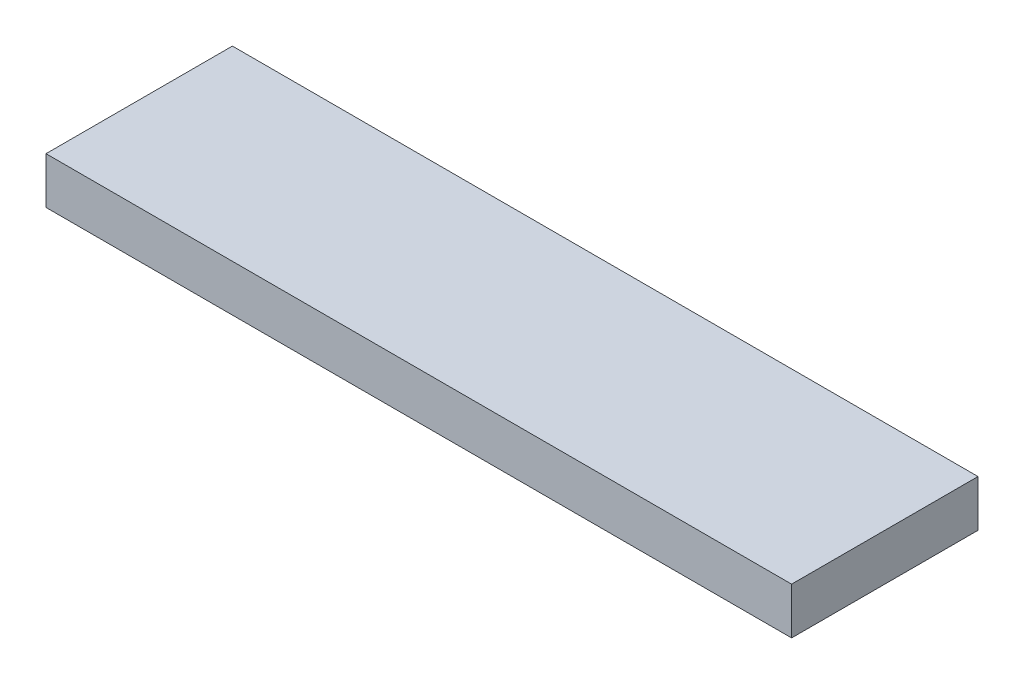
ISO-10303-21;
HEADER;
FILE_DESCRIPTION(('STEP AP214'),'2;1');
FILE_NAME('part.step','',(''),(''),'','','');
FILE_SCHEMA(('AUTOMOTIVE_DESIGN { 1 0 10303 214 1 1 1 1 }'));
ENDSEC;
DATA;
#1=APPLICATION_CONTEXT('core data for automotive mechanical design processes');
#2=APPLICATION_PROTOCOL_DEFINITION('international standard','automotive_design',2000,#1);
#3=PRODUCT_CONTEXT('',#1,'mechanical');
#4=PRODUCT('Part','Part','',(#3));
#5=PRODUCT_RELATED_PRODUCT_CATEGORY('part','',(#4));
#6=PRODUCT_DEFINITION_FORMATION('','',#4);
#7=PRODUCT_DEFINITION_CONTEXT('part definition',#1,'design');
#8=PRODUCT_DEFINITION('design','',#6,#7);
#9=PRODUCT_DEFINITION_SHAPE('','',#8);
#10=(LENGTH_UNIT() NAMED_UNIT(*) SI_UNIT(.MILLI.,.METRE.));
#11=(NAMED_UNIT(*) PLANE_ANGLE_UNIT() SI_UNIT($,.RADIAN.));
#12=(NAMED_UNIT(*) SI_UNIT($,.STERADIAN.) SOLID_ANGLE_UNIT());
#13=UNCERTAINTY_MEASURE_WITH_UNIT(LENGTH_MEASURE(1.E-05),#10,'distance_accuracy_value','');
#14=(GEOMETRIC_REPRESENTATION_CONTEXT(3) GLOBAL_UNCERTAINTY_ASSIGNED_CONTEXT((#13)) GLOBAL_UNIT_ASSIGNED_CONTEXT((#10,
#11,#12)) REPRESENTATION_CONTEXT('',''));
#15=CARTESIAN_POINT('',(0.,0.,0.));
#16=DIRECTION('',(0.,0.,1.));
#17=DIRECTION('',(1.,0.,0.));
#18=AXIS2_PLACEMENT_3D('',#15,#16,#17);
#19=CARTESIAN_POINT('',(0.,0.5,0.));
#20=DIRECTION('',(1.,0.,0.));
#21=DIRECTION('',(0.,0.,-1.));
#22=AXIS2_PLACEMENT_3D('',#19,#20,#21);
#23=PLANE('',#22);
#24=DIRECTION('',(0.,0.,1.));
#25=VECTOR('',#24,1.);
#26=CARTESIAN_POINT('',(0.,0.,0.));
#27=LINE('',#26,#25);
#28=CARTESIAN_POINT('',(0.,0.,-2.));
#29=VERTEX_POINT('',#28);
#30=CARTESIAN_POINT('',(0.,0.,0.));
#31=VERTEX_POINT('',#30);
#32=EDGE_CURVE('E113',#29,#31,#27,.T.);
#33=ORIENTED_EDGE('',*,*,#32,.T.);
#34=DIRECTION('',(0.,-1.,0.));
#35=VECTOR('',#34,1.);
#36=CARTESIAN_POINT('',(0.,0.5,0.));
#37=LINE('',#36,#35);
#38=CARTESIAN_POINT('',(0.,0.5,0.));
#39=VERTEX_POINT('',#38);
#40=EDGE_CURVE('E11',#39,#31,#37,.T.);
#41=ORIENTED_EDGE('',*,*,#40,.F.);
#42=DIRECTION('',(0.,0.,1.));
#43=VECTOR('',#42,1.);
#44=CARTESIAN_POINT('',(0.,0.5,0.));
#45=LINE('',#44,#43);
#46=CARTESIAN_POINT('',(0.,0.5,-2.));
#47=VERTEX_POINT('',#46);
#48=EDGE_CURVE('E97',#47,#39,#45,.T.);
#49=ORIENTED_EDGE('',*,*,#48,.F.);
#50=DIRECTION('',(0.,-1.,0.));
#51=VECTOR('',#50,1.);
#52=CARTESIAN_POINT('',(0.,0.5,-2.));
#53=LINE('',#52,#51);
#54=EDGE_CURVE('E109',#47,#29,#53,.T.);
#55=ORIENTED_EDGE('',*,*,#54,.T.);
#56=EDGE_LOOP('',(#33,#41,#49,#55));
#57=FACE_BOUND('',#56,.T.);
#58=ADVANCED_FACE('F45',(#57),#23,.F.);
#59=CARTESIAN_POINT('',(0.,0.5,0.));
#60=DIRECTION('',(0.,0.,-1.));
#61=DIRECTION('',(-1.,0.,0.));
#62=AXIS2_PLACEMENT_3D('',#59,#60,#61);
#63=PLANE('',#62);
#64=DIRECTION('',(1.,0.,0.));
#65=VECTOR('',#64,1.);
#66=CARTESIAN_POINT('',(0.,0.,0.));
#67=LINE('',#66,#65);
#68=CARTESIAN_POINT('',(8.,0.,0.));
#69=VERTEX_POINT('',#68);
#70=EDGE_CURVE('E102',#31,#69,#67,.T.);
#71=ORIENTED_EDGE('',*,*,#70,.T.);
#72=DIRECTION('',(0.,-1.,0.));
#73=VECTOR('',#72,1.);
#74=CARTESIAN_POINT('',(8.,0.5,0.));
#75=LINE('',#74,#73);
#76=CARTESIAN_POINT('',(8.,0.5,0.));
#77=VERTEX_POINT('',#76);
#78=EDGE_CURVE('E54',#77,#69,#75,.T.);
#79=ORIENTED_EDGE('',*,*,#78,.F.);
#80=DIRECTION('',(1.,0.,0.));
#81=VECTOR('',#80,1.);
#82=CARTESIAN_POINT('',(0.,0.5,0.));
#83=LINE('',#82,#81);
#84=EDGE_CURVE('E92',#39,#77,#83,.T.);
#85=ORIENTED_EDGE('',*,*,#84,.F.);
#86=ORIENTED_EDGE('',*,*,#40,.T.);
#87=EDGE_LOOP('',(#71,#79,#85,#86));
#88=FACE_BOUND('',#87,.T.);
#89=ADVANCED_FACE('F101',(#88),#63,.F.);
#90=CARTESIAN_POINT('',(8.,0.5,0.));
#91=DIRECTION('',(-1.,0.,0.));
#92=DIRECTION('',(0.,0.,1.));
#93=AXIS2_PLACEMENT_3D('',#90,#91,#92);
#94=PLANE('',#93);
#95=DIRECTION('',(0.,0.,-1.));
#96=VECTOR('',#95,1.);
#97=CARTESIAN_POINT('',(8.,0.,0.));
#98=LINE('',#97,#96);
#99=CARTESIAN_POINT('',(8.,0.,-2.));
#100=VERTEX_POINT('',#99);
#101=EDGE_CURVE('E79',#69,#100,#98,.T.);
#102=ORIENTED_EDGE('',*,*,#101,.T.);
#103=DIRECTION('',(0.,-1.,0.));
#104=VECTOR('',#103,1.);
#105=CARTESIAN_POINT('',(8.,0.5,-2.));
#106=LINE('',#105,#104);
#107=CARTESIAN_POINT('',(8.,0.5,-2.));
#108=VERTEX_POINT('',#107);
#109=EDGE_CURVE('E104',#108,#100,#106,.T.);
#110=ORIENTED_EDGE('',*,*,#109,.F.);
#111=DIRECTION('',(0.,0.,-1.));
#112=VECTOR('',#111,1.);
#113=CARTESIAN_POINT('',(8.,0.5,0.));
#114=LINE('',#113,#112);
#115=EDGE_CURVE('E95',#77,#108,#114,.T.);
#116=ORIENTED_EDGE('',*,*,#115,.F.);
#117=ORIENTED_EDGE('',*,*,#78,.T.);
#118=EDGE_LOOP('',(#102,#110,#116,#117));
#119=FACE_BOUND('',#118,.T.);
#120=ADVANCED_FACE('F105',(#119),#94,.F.);
#121=CARTESIAN_POINT('',(0.,0.5,-2.));
#122=DIRECTION('',(0.,0.,1.));
#123=DIRECTION('',(1.,0.,0.));
#124=AXIS2_PLACEMENT_3D('',#121,#122,#123);
#125=PLANE('',#124);
#126=DIRECTION('',(-1.,0.,0.));
#127=VECTOR('',#126,1.);
#128=CARTESIAN_POINT('',(0.,0.,-2.));
#129=LINE('',#128,#127);
#130=EDGE_CURVE('E85',#100,#29,#129,.T.);
#131=ORIENTED_EDGE('',*,*,#130,.T.);
#132=ORIENTED_EDGE('',*,*,#54,.F.);
#133=DIRECTION('',(-1.,0.,0.));
#134=VECTOR('',#133,1.);
#135=CARTESIAN_POINT('',(0.,0.5,-2.));
#136=LINE('',#135,#134);
#137=EDGE_CURVE('E62',#108,#47,#136,.T.);
#138=ORIENTED_EDGE('',*,*,#137,.F.);
#139=ORIENTED_EDGE('',*,*,#109,.T.);
#140=EDGE_LOOP('',(#131,#132,#138,#139));
#141=FACE_BOUND('',#140,.T.);
#142=ADVANCED_FACE('F126',(#141),#125,.F.);
#143=CARTESIAN_POINT('',(0.,0.5,0.));
#144=DIRECTION('',(0.,-1.,0.));
#145=DIRECTION('',(0.,0.,-1.));
#146=AXIS2_PLACEMENT_3D('',#143,#144,#145);
#147=PLANE('',#146);
#148=ORIENTED_EDGE('',*,*,#48,.T.);
#149=ORIENTED_EDGE('',*,*,#84,.T.);
#150=ORIENTED_EDGE('',*,*,#115,.T.);
#151=ORIENTED_EDGE('',*,*,#137,.T.);
#152=EDGE_LOOP('',(#148,#149,#150,#151));
#153=FACE_BOUND('',#152,.T.);
#154=ADVANCED_FACE('F93',(#153),#147,.F.);
#155=CARTESIAN_POINT('',(0.,0.,0.));
#156=DIRECTION('',(0.,-1.,0.));
#157=DIRECTION('',(0.,0.,-1.));
#158=AXIS2_PLACEMENT_3D('',#155,#156,#157);
#159=PLANE('',#158);
#160=ORIENTED_EDGE('',*,*,#32,.F.);
#161=ORIENTED_EDGE('',*,*,#130,.F.);
#162=ORIENTED_EDGE('',*,*,#101,.F.);
#163=ORIENTED_EDGE('',*,*,#70,.F.);
#164=EDGE_LOOP('',(#160,#161,#162,#163));
#165=FACE_BOUND('',#164,.T.);
#166=ADVANCED_FACE('F129',(#165),#159,.T.);
#167=CLOSED_SHELL('',(#58,#89,#120,#142,#154,#166));
#168=MANIFOLD_SOLID_BREP('B2',#167);
#169=ADVANCED_BREP_SHAPE_REPRESENTATION('',(#18,#168),#14);
#170=SHAPE_DEFINITION_REPRESENTATION(#9,#169);
ENDSEC;
END-ISO-10303-21;
